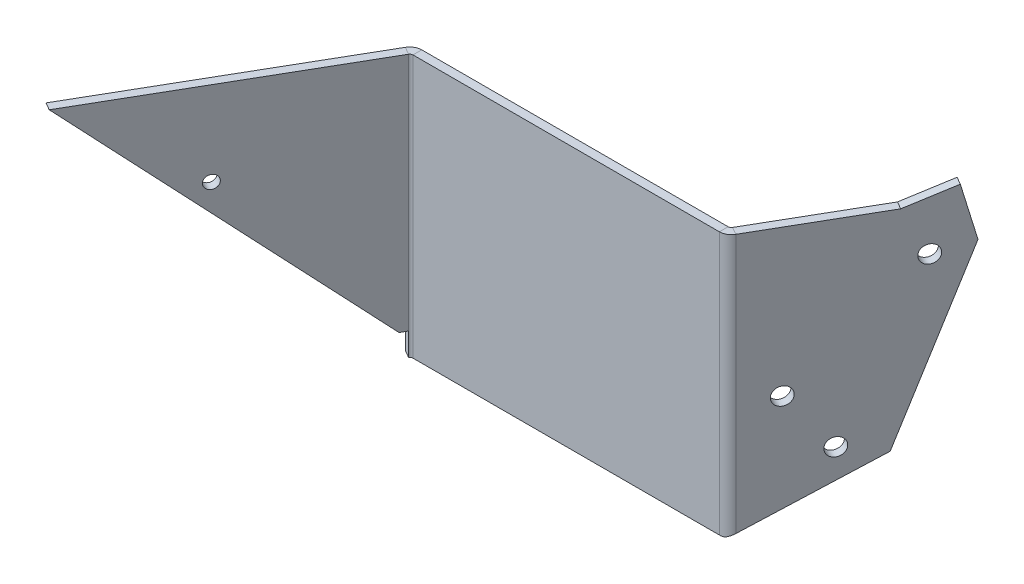
ISO-10303-21;
HEADER;
FILE_DESCRIPTION(('STEP AP214'),'2;1');
FILE_NAME('part.step','',(''),(''),'','','');
FILE_SCHEMA(('AUTOMOTIVE_DESIGN { 1 0 10303 214 1 1 1 1 }'));
ENDSEC;
DATA;
#1=APPLICATION_CONTEXT('core data for automotive mechanical design processes');
#2=APPLICATION_PROTOCOL_DEFINITION('international standard','automotive_design',2000,#1);
#3=PRODUCT_CONTEXT('',#1,'mechanical');
#4=PRODUCT('Part','Part','',(#3));
#5=PRODUCT_RELATED_PRODUCT_CATEGORY('part','',(#4));
#6=PRODUCT_DEFINITION_FORMATION('','',#4);
#7=PRODUCT_DEFINITION_CONTEXT('part definition',#1,'design');
#8=PRODUCT_DEFINITION('design','',#6,#7);
#9=PRODUCT_DEFINITION_SHAPE('','',#8);
#10=(LENGTH_UNIT() NAMED_UNIT(*) SI_UNIT(.MILLI.,.METRE.));
#11=(NAMED_UNIT(*) PLANE_ANGLE_UNIT() SI_UNIT($,.RADIAN.));
#12=(NAMED_UNIT(*) SI_UNIT($,.STERADIAN.) SOLID_ANGLE_UNIT());
#13=UNCERTAINTY_MEASURE_WITH_UNIT(LENGTH_MEASURE(1.E-05),#10,'distance_accuracy_value','');
#14=(GEOMETRIC_REPRESENTATION_CONTEXT(3) GLOBAL_UNCERTAINTY_ASSIGNED_CONTEXT((#13)) GLOBAL_UNIT_ASSIGNED_CONTEXT((#10,
#11,#12)) REPRESENTATION_CONTEXT('',''));
#15=CARTESIAN_POINT('',(0.,0.,0.));
#16=DIRECTION('',(0.,0.,1.));
#17=DIRECTION('',(1.,0.,0.));
#18=AXIS2_PLACEMENT_3D('',#15,#16,#17);
#19=CARTESIAN_POINT('',(-52.3949709333305,-24.77,26.392373452712));
#20=DIRECTION('',(0.,-1.,0.));
#21=DIRECTION('',(0.500000000000004,0.,-0.866025403784436));
#22=AXIS2_PLACEMENT_3D('',#19,#20,#21);
#23=PLANE('',#22);
#24=DIRECTION('',(-0.866025403784436,0.,-0.500000000000004));
#25=VECTOR('',#24,1.);
#26=CARTESIAN_POINT('',(-37.3699651199965,-24.77,0.368299999999989));
#27=LINE('',#26,#25);
#28=CARTESIAN_POINT('',(-35.6379143124276,-24.77,1.3683));
#29=VERTEX_POINT('',#28);
#30=CARTESIAN_POINT('',(-37.3699651199965,-24.77,0.368299999999989));
#31=VERTEX_POINT('',#30);
#32=EDGE_CURVE('E11',#29,#31,#27,.T.);
#33=ORIENTED_EDGE('',*,*,#32,.F.);
#34=DIRECTION('',(-0.500000000000004,0.,0.866025403784436));
#35=VECTOR('',#34,1.);
#36=CARTESIAN_POINT('',(-26.2422635063927,-24.77,-14.9054445662278));
#37=LINE('',#36,#35);
#38=CARTESIAN_POINT('',(-36.4373869925521,-24.77,2.75302730123892));
#39=VERTEX_POINT('',#38);
#40=EDGE_CURVE('E290',#29,#39,#37,.T.);
#41=ORIENTED_EDGE('',*,*,#40,.T.);
#42=DIRECTION('',(-0.866025403784436,0.,-0.500000000000004));
#43=VECTOR('',#42,1.);
#44=CARTESIAN_POINT('',(-38.169437800121,-24.77,1.75302730123891));
#45=LINE('',#44,#43);
#46=CARTESIAN_POINT('',(-38.169437800121,-24.77,1.75302730123891));
#47=VERTEX_POINT('',#46);
#48=EDGE_CURVE('E58',#39,#47,#45,.T.);
#49=ORIENTED_EDGE('',*,*,#48,.T.);
#50=DIRECTION('',(0.500000000000004,0.,-0.866025403784436));
#51=VECTOR('',#50,1.);
#52=CARTESIAN_POINT('',(-52.3949709333305,-24.77,26.392373452712));
#53=LINE('',#52,#51);
#54=EDGE_CURVE('E341',#31,#47,#53,.F.);
#55=ORIENTED_EDGE('',*,*,#54,.F.);
#56=EDGE_LOOP('',(#33,#41,#49,#55));
#57=FACE_BOUND('',#56,.T.);
#58=ADVANCED_FACE('F47',(#57),#23,.T.);
#59=CARTESIAN_POINT('',(-67.4199767466646,30.,52.416446905424));
#60=DIRECTION('',(0.341722230403334,0.730002513004366,-0.591880265134327));
#61=DIRECTION('',(-0.365001256502186,0.683444460806663,0.63220072108826));
#62=AXIS2_PLACEMENT_3D('',#59,#60,#61);
#63=PLANE('',#62);
#64=ORIENTED_EDGE('',*,*,#48,.F.);
#65=DIRECTION('',(-0.365001256502186,0.683444460806663,0.63220072108826));
#66=VECTOR('',#65,1.);
#67=CARTESIAN_POINT('',(-65.6879259390957,30.,53.416446905424));
#68=LINE('',#67,#66);
#69=CARTESIAN_POINT('',(-65.6879259390957,30.,53.416446905424));
#70=VERTEX_POINT('',#69);
#71=EDGE_CURVE('E284',#39,#70,#68,.T.);
#72=ORIENTED_EDGE('',*,*,#71,.T.);
#73=DIRECTION('',(-0.866025403784436,0.,-0.500000000000004));
#74=VECTOR('',#73,1.);
#75=CARTESIAN_POINT('',(-67.4199767466646,30.,52.416446905424));
#76=LINE('',#75,#74);
#77=CARTESIAN_POINT('',(-67.4199767466646,30.,52.416446905424));
#78=VERTEX_POINT('',#77);
#79=EDGE_CURVE('E183',#70,#78,#76,.T.);
#80=ORIENTED_EDGE('',*,*,#79,.T.);
#81=DIRECTION('',(-0.365001256502186,0.683444460806663,0.63220072108826));
#82=VECTOR('',#81,1.);
#83=CARTESIAN_POINT('',(-67.4199767466646,30.,52.416446905424));
#84=LINE('',#83,#82);
#85=EDGE_CURVE('E191',#47,#78,#84,.T.);
#86=ORIENTED_EDGE('',*,*,#85,.F.);
#87=EDGE_LOOP('',(#64,#72,#80,#86));
#88=FACE_BOUND('',#87,.T.);
#89=ADVANCED_FACE('F348',(#88),#63,.F.);
#90=CARTESIAN_POINT('',(-27.9743143139616,30.,-15.9054445662278));
#91=DIRECTION('',(0.,1.,0.));
#92=DIRECTION('',(-0.500000000000004,0.,0.866025403784436));
#93=AXIS2_PLACEMENT_3D('',#90,#91,#92);
#94=PLANE('',#93);
#95=ORIENTED_EDGE('',*,*,#79,.F.);
#96=DIRECTION('',(-0.500000000000004,0.,0.866025403784436));
#97=VECTOR('',#96,1.);
#98=CARTESIAN_POINT('',(-26.2422635063927,30.,-14.9054445662278));
#99=LINE('',#98,#97);
#100=CARTESIAN_POINT('',(-35.6379143124276,30.,1.3683));
#101=VERTEX_POINT('',#100);
#102=EDGE_CURVE('E177',#101,#70,#99,.T.);
#103=ORIENTED_EDGE('',*,*,#102,.F.);
#104=DIRECTION('',(-0.866025403784436,0.,-0.500000000000004));
#105=VECTOR('',#104,1.);
#106=CARTESIAN_POINT('',(-37.3699651199965,30.,0.36829999999999));
#107=LINE('',#106,#105);
#108=CARTESIAN_POINT('',(-37.3699651199965,30.,0.36829999999999));
#109=VERTEX_POINT('',#108);
#110=EDGE_CURVE('E172',#101,#109,#107,.T.);
#111=ORIENTED_EDGE('',*,*,#110,.T.);
#112=DIRECTION('',(-0.500000000000004,0.,0.866025403784436));
#113=VECTOR('',#112,1.);
#114=CARTESIAN_POINT('',(-27.9743143139616,30.,-15.9054445662278));
#115=LINE('',#114,#113);
#116=EDGE_CURVE('E175',#109,#78,#115,.T.);
#117=ORIENTED_EDGE('',*,*,#116,.T.);
#118=EDGE_LOOP('',(#95,#103,#111,#117));
#119=FACE_BOUND('',#118,.T.);
#120=ADVANCED_FACE('F173',(#119),#94,.T.);
#121=CARTESIAN_POINT('',(-35.,30.,1.7366));
#122=DIRECTION('',(0.,1.,0.));
#123=DIRECTION('',(0.,0.,1.));
#124=AXIS2_PLACEMENT_3D('',#121,#122,#123);
#125=PLANE('',#124);
#126=ORIENTED_EDGE('',*,*,#110,.F.);
#127=CARTESIAN_POINT('',(-35.,30.,1.7366));
#128=DIRECTION('',(0.,1.,0.));
#129=DIRECTION('',(0.,0.,1.));
#130=AXIS2_PLACEMENT_3D('',#127,#128,#129);
#131=CIRCLE('',#130,0.736599999999998);
#132=CARTESIAN_POINT('',(-35.,30.,1.));
#133=VERTEX_POINT('',#132);
#134=EDGE_CURVE('E280',#101,#133,#131,.F.);
#135=ORIENTED_EDGE('',*,*,#134,.T.);
#136=DIRECTION('',(0.,0.,-1.));
#137=VECTOR('',#136,1.);
#138=CARTESIAN_POINT('',(-35.,30.,-0.999999999999999));
#139=LINE('',#138,#137);
#140=CARTESIAN_POINT('',(-35.,30.,-0.999999999999999));
#141=VERTEX_POINT('',#140);
#142=EDGE_CURVE('E132',#133,#141,#139,.T.);
#143=ORIENTED_EDGE('',*,*,#142,.T.);
#144=CARTESIAN_POINT('',(-35.,30.,1.7366));
#145=DIRECTION('',(0.,-1.,0.));
#146=DIRECTION('',(0.,0.,1.));
#147=AXIS2_PLACEMENT_3D('',#144,#145,#146);
#148=CIRCLE('',#147,2.7366);
#149=EDGE_CURVE('E194',#109,#141,#148,.T.);
#150=ORIENTED_EDGE('',*,*,#149,.F.);
#151=EDGE_LOOP('',(#126,#135,#143,#150));
#152=FACE_BOUND('',#151,.T.);
#153=ADVANCED_FACE('F196',(#152),#125,.T.);
#154=CARTESIAN_POINT('',(35.,30.,-1.));
#155=DIRECTION('',(0.,1.,0.));
#156=DIRECTION('',(1.,0.,0.));
#157=AXIS2_PLACEMENT_3D('',#154,#155,#156);
#158=PLANE('',#157);
#159=ORIENTED_EDGE('',*,*,#142,.F.);
#160=DIRECTION('',(1.,0.,0.));
#161=VECTOR('',#160,1.);
#162=CARTESIAN_POINT('',(0.,30.,1.));
#163=LINE('',#162,#161);
#164=CARTESIAN_POINT('',(35.,30.,1.));
#165=VERTEX_POINT('',#164);
#166=EDGE_CURVE('E220',#133,#165,#163,.T.);
#167=ORIENTED_EDGE('',*,*,#166,.T.);
#168=DIRECTION('',(0.,0.,-1.));
#169=VECTOR('',#168,1.);
#170=CARTESIAN_POINT('',(35.,30.,-0.999999999999987));
#171=LINE('',#170,#169);
#172=CARTESIAN_POINT('',(35.,30.,-0.999999999999987));
#173=VERTEX_POINT('',#172);
#174=EDGE_CURVE('E332',#165,#173,#171,.T.);
#175=ORIENTED_EDGE('',*,*,#174,.T.);
#176=DIRECTION('',(1.,0.,0.));
#177=VECTOR('',#176,1.);
#178=CARTESIAN_POINT('',(35.,30.,-1.));
#179=LINE('',#178,#177);
#180=EDGE_CURVE('E413',#141,#173,#179,.T.);
#181=ORIENTED_EDGE('',*,*,#180,.F.);
#182=EDGE_LOOP('',(#159,#167,#175,#181));
#183=FACE_BOUND('',#182,.T.);
#184=ADVANCED_FACE('F431',(#183),#158,.T.);
#185=CARTESIAN_POINT('',(35.,30.,-1.7366));
#186=DIRECTION('',(0.,1.,0.));
#187=DIRECTION('',(0.,0.,1.));
#188=AXIS2_PLACEMENT_3D('',#185,#186,#187);
#189=PLANE('',#188);
#190=ORIENTED_EDGE('',*,*,#174,.F.);
#191=CARTESIAN_POINT('',(35.,30.,-1.7366));
#192=DIRECTION('',(0.,1.,0.));
#193=DIRECTION('',(0.,0.,1.));
#194=AXIS2_PLACEMENT_3D('',#191,#192,#193);
#195=CIRCLE('',#194,2.73660000000001);
#196=CARTESIAN_POINT('',(37.3699651199965,30.,-0.368299999999981));
#197=VERTEX_POINT('',#196);
#198=EDGE_CURVE('E246',#197,#165,#195,.F.);
#199=ORIENTED_EDGE('',*,*,#198,.F.);
#200=DIRECTION('',(-0.866025403784436,0.,-0.500000000000004));
#201=VECTOR('',#200,1.);
#202=CARTESIAN_POINT('',(35.6379143124276,30.,-1.36829999999999));
#203=LINE('',#202,#201);
#204=CARTESIAN_POINT('',(35.6379143124276,30.,-1.36829999999999));
#205=VERTEX_POINT('',#204);
#206=EDGE_CURVE('E328',#197,#205,#203,.T.);
#207=ORIENTED_EDGE('',*,*,#206,.T.);
#208=CARTESIAN_POINT('',(35.,30.,-1.7366));
#209=DIRECTION('',(0.,-1.,0.));
#210=DIRECTION('',(0.,0.,1.));
#211=AXIS2_PLACEMENT_3D('',#208,#209,#210);
#212=CIRCLE('',#211,0.736600000000014);
#213=EDGE_CURVE('E354',#205,#173,#212,.T.);
#214=ORIENTED_EDGE('',*,*,#213,.T.);
#215=EDGE_LOOP('',(#190,#199,#207,#214));
#216=FACE_BOUND('',#215,.T.);
#217=ADVANCED_FACE('F440',(#216),#189,.T.);
#218=CARTESIAN_POINT('',(69.8479259390957,30.,-60.6217782649106));
#219=DIRECTION('',(0.,-1.,0.));
#220=DIRECTION('',(-0.500000000000004,0.,0.866025403784436));
#221=AXIS2_PLACEMENT_3D('',#218,#219,#220);
#222=PLANE('',#221);
#223=ORIENTED_EDGE('',*,*,#206,.F.);
#224=DIRECTION('',(0.500000000000004,0.,-0.866025403784436));
#225=VECTOR('',#224,1.);
#226=CARTESIAN_POINT('',(27.9743143139616,30.,15.9054445662278));
#227=LINE('',#226,#225);
#228=CARTESIAN_POINT('',(51.1599651199966,30.,-24.2532806363747));
#229=VERTEX_POINT('',#228);
#230=EDGE_CURVE('E231',#197,#229,#227,.T.);
#231=ORIENTED_EDGE('',*,*,#230,.T.);
#232=DIRECTION('',(-0.866025403784436,0.,-0.500000000000004));
#233=VECTOR('',#232,1.);
#234=CARTESIAN_POINT('',(49.4279143124277,30.,-25.2532806363747));
#235=LINE('',#234,#233);
#236=CARTESIAN_POINT('',(49.4279143124277,30.,-25.2532806363747));
#237=VERTEX_POINT('',#236);
#238=EDGE_CURVE('E326',#229,#237,#235,.T.);
#239=ORIENTED_EDGE('',*,*,#238,.T.);
#240=DIRECTION('',(-0.500000000000004,0.,0.866025403784436));
#241=VECTOR('',#240,1.);
#242=CARTESIAN_POINT('',(69.8479259390957,30.,-60.6217782649106));
#243=LINE('',#242,#241);
#244=EDGE_CURVE('E381',#205,#237,#243,.F.);
#245=ORIENTED_EDGE('',*,*,#244,.F.);
#246=EDGE_LOOP('',(#223,#231,#239,#245));
#247=FACE_BOUND('',#246,.T.);
#248=ADVANCED_FACE('F456',(#247),#222,.F.);
#249=CARTESIAN_POINT('',(59.4979143124278,36.1629106235044,-42.6950322685933));
#250=DIRECTION('',(-0.146305139516736,0.95623178393314,0.253407935051437));
#251=DIRECTION('',(0.478115891966574,0.29261027903347,-0.828121016792209));
#252=AXIS2_PLACEMENT_3D('',#249,#250,#251);
#253=PLANE('',#252);
#254=ORIENTED_EDGE('',*,*,#238,.F.);
#255=DIRECTION('',(0.478115891966574,0.29261027903347,-0.828121016792209));
#256=VECTOR('',#255,1.);
#257=CARTESIAN_POINT('',(61.2299651199967,36.1629106235044,-41.6950322685933));
#258=LINE('',#257,#256);
#259=CARTESIAN_POINT('',(56.1468502366864,33.0520086657243,-32.8908190299904));
#260=VERTEX_POINT('',#259);
#261=EDGE_CURVE('E261',#229,#260,#258,.T.);
#262=ORIENTED_EDGE('',*,*,#261,.T.);
#263=DIRECTION('',(-0.866025403784436,0.,-0.500000000000004));
#264=VECTOR('',#263,1.);
#265=CARTESIAN_POINT('',(54.4147994291175,33.0520086657242,-33.8908190299904));
#266=LINE('',#265,#264);
#267=CARTESIAN_POINT('',(54.4147994291175,33.0520086657242,-33.8908190299904));
#268=VERTEX_POINT('',#267);
#269=EDGE_CURVE('E324',#260,#268,#266,.T.);
#270=ORIENTED_EDGE('',*,*,#269,.T.);
#271=DIRECTION('',(0.478115891966574,0.29261027903347,-0.828121016792209));
#272=VECTOR('',#271,1.);
#273=CARTESIAN_POINT('',(59.4979143124278,36.1629106235044,-42.6950322685933));
#274=LINE('',#273,#272);
#275=EDGE_CURVE('E380',#237,#268,#274,.T.);
#276=ORIENTED_EDGE('',*,*,#275,.F.);
#277=EDGE_LOOP('',(#254,#262,#270,#276));
#278=FACE_BOUND('',#277,.T.);
#279=ADVANCED_FACE('F683',(#278),#253,.T.);
#280=CARTESIAN_POINT('',(54.4147994291175,33.0520086657242,-33.8908190299904));
#281=DIRECTION('',(-0.48415937874254,-0.249717408088754,0.838588642943053));
#282=DIRECTION('',(-0.124858704044378,0.968318757485072,0.216261619172066));
#283=AXIS2_PLACEMENT_3D('',#280,#281,#282);
#284=PLANE('',#283);
#285=ORIENTED_EDGE('',*,*,#269,.F.);
#286=DIRECTION('',(-0.124858704044378,0.968318757485072,0.216261619172066));
#287=VECTOR('',#286,1.);
#288=CARTESIAN_POINT('',(56.1468502366864,33.0520086657242,-32.8908190299904));
#289=LINE('',#288,#287);
#290=CARTESIAN_POINT('',(57.6256988388714,21.5830698205205,-35.4522599456771));
#291=VERTEX_POINT('',#290);
#292=EDGE_CURVE('E260',#291,#260,#289,.T.);
#293=ORIENTED_EDGE('',*,*,#292,.F.);
#294=DIRECTION('',(-0.866025403784436,0.,-0.500000000000004));
#295=VECTOR('',#294,1.);
#296=CARTESIAN_POINT('',(55.8936480313026,21.5830698205205,-36.4522599456771));
#297=LINE('',#296,#295);
#298=CARTESIAN_POINT('',(55.8936480313026,21.5830698205205,-36.4522599456771));
#299=VERTEX_POINT('',#298);
#300=EDGE_CURVE('E316',#291,#299,#297,.T.);
#301=ORIENTED_EDGE('',*,*,#300,.T.);
#302=DIRECTION('',(-0.124858704044378,0.968318757485072,0.216261619172066));
#303=VECTOR('',#302,1.);
#304=CARTESIAN_POINT('',(54.4147994291175,33.0520086657242,-33.8908190299904));
#305=LINE('',#304,#303);
#306=EDGE_CURVE('E373',#299,#268,#305,.T.);
#307=ORIENTED_EDGE('',*,*,#306,.T.);
#308=EDGE_LOOP('',(#285,#293,#301,#307));
#309=FACE_BOUND('',#308,.T.);
#310=ADVANCED_FACE('F678',(#309),#284,.F.);
#311=CARTESIAN_POINT('',(48.5513043562291,-17.64,-23.7349476538179));
#312=DIRECTION('',(-0.468258578098388,0.350621756525628,0.811047648346359));
#313=DIRECTION('',(0.175310878262815,0.936517156196769,-0.303647348270715));
#314=AXIS2_PLACEMENT_3D('',#311,#312,#313);
#315=PLANE('',#314);
#316=ORIENTED_EDGE('',*,*,#300,.F.);
#317=DIRECTION('',(0.175310878262815,0.936517156196769,-0.303647348270715));
#318=VECTOR('',#317,1.);
#319=CARTESIAN_POINT('',(50.2833551637979,-17.64,-22.7349476538179));
#320=LINE('',#319,#318);
#321=CARTESIAN_POINT('',(50.2833551637979,-17.64,-22.7349476538179));
#322=VERTEX_POINT('',#321);
#323=EDGE_CURVE('E255',#322,#291,#320,.T.);
#324=ORIENTED_EDGE('',*,*,#323,.F.);
#325=DIRECTION('',(-0.866025403784436,0.,-0.500000000000004));
#326=VECTOR('',#325,1.);
#327=CARTESIAN_POINT('',(48.5513043562291,-17.64,-23.7349476538179));
#328=LINE('',#327,#326);
#329=CARTESIAN_POINT('',(48.5513043562291,-17.64,-23.7349476538179));
#330=VERTEX_POINT('',#329);
#331=EDGE_CURVE('E319',#322,#330,#328,.T.);
#332=ORIENTED_EDGE('',*,*,#331,.T.);
#333=DIRECTION('',(0.175310878262815,0.936517156196769,-0.303647348270715));
#334=VECTOR('',#333,1.);
#335=CARTESIAN_POINT('',(48.5513043562291,-17.64,-23.7349476538179));
#336=LINE('',#335,#334);
#337=EDGE_CURVE('E372',#330,#299,#336,.T.);
#338=ORIENTED_EDGE('',*,*,#337,.T.);
#339=EDGE_LOOP('',(#316,#324,#332,#338));
#340=FACE_BOUND('',#339,.T.);
#341=ADVANCED_FACE('F667',(#340),#315,.F.);
#342=CARTESIAN_POINT('',(34.7629143124276,-30.,0.147244456622799));
#343=DIRECTION('',(-0.204500330906686,0.912534086287316,0.354204963295023));
#344=DIRECTION('',(0.456267043143662,0.409000661813368,-0.790277700544035));
#345=AXIS2_PLACEMENT_3D('',#342,#343,#344);
#346=PLANE('',#345);
#347=ORIENTED_EDGE('',*,*,#331,.F.);
#348=DIRECTION('',(0.456267043143662,0.409000661813368,-0.790277700544035));
#349=VECTOR('',#348,1.);
#350=CARTESIAN_POINT('',(36.4949651199965,-30.,1.14724445662281));
#351=LINE('',#350,#349);
#352=CARTESIAN_POINT('',(37.3699651199965,-29.2156444685968,-0.368299999999984));
#353=VERTEX_POINT('',#352);
#354=EDGE_CURVE('E251',#353,#322,#351,.T.);
#355=ORIENTED_EDGE('',*,*,#354,.F.);
#356=DIRECTION('',(-0.866025403784436,0.,-0.500000000000004));
#357=VECTOR('',#356,1.);
#358=CARTESIAN_POINT('',(35.6379143124276,-29.2156444685968,-1.36829999999999));
#359=LINE('',#358,#357);
#360=CARTESIAN_POINT('',(35.6379143124276,-29.2156444685968,-1.36829999999999));
#361=VERTEX_POINT('',#360);
#362=EDGE_CURVE('E311',#353,#361,#359,.T.);
#363=ORIENTED_EDGE('',*,*,#362,.T.);
#364=DIRECTION('',(0.456267043143662,0.409000661813368,-0.790277700544035));
#365=VECTOR('',#364,1.);
#366=CARTESIAN_POINT('',(34.7629143124276,-30.,0.147244456622799));
#367=LINE('',#366,#365);
#368=EDGE_CURVE('E369',#361,#330,#367,.T.);
#369=ORIENTED_EDGE('',*,*,#368,.T.);
#370=EDGE_LOOP('',(#347,#355,#363,#369));
#371=FACE_BOUND('',#370,.T.);
#372=ADVANCED_FACE('F476',(#371),#346,.F.);
#373=CARTESIAN_POINT('',(36.3683,-27.9890916987466,-4.1065651199965));
#374=CARTESIAN_POINT('',(36.0349666666667,-27.9890916987466,-3.52921485080688));
#375=CARTESIAN_POINT('',(35.7016333333333,-27.9890916987466,-2.95186458161725));
#376=CARTESIAN_POINT('',(35.3683,-27.9890916987466,-2.37451431242763));
#377=CARTESIAN_POINT('',(31.628369760007,-27.9890916987466,-6.84316511999654));
#378=CARTESIAN_POINT('',(32.4497369650529,-27.9890916987466,-5.59914818414024));
#379=CARTESIAN_POINT('',(33.2711041700988,-27.9890916987466,-4.35513124828395));
#380=CARTESIAN_POINT('',(34.0924713751447,-27.9890916987466,-3.11111431242765));
#381=CARTESIAN_POINT('',(28.891769760007,-30.442197238447,-2.10323488000353));
#382=CARTESIAN_POINT('',(30.3798036317196,-30.4421972384471,-2.01391848252649));
#383=CARTESIAN_POINT('',(31.8678375034321,-30.442197238447,-1.92460208504944));
#384=CARTESIAN_POINT('',(33.3558713751447,-30.442197238447,-1.83528568757239));
#385=CARTESIAN_POINT('',(33.6317,-30.442197238447,0.633365119996502));
#386=CARTESIAN_POINT('',(33.9650333333333,-30.442197238447,0.0560148508068768));
#387=CARTESIAN_POINT('',(34.2983666666666,-30.442197238447,-0.521335418382748));
#388=CARTESIAN_POINT('',(34.6317,-30.442197238447,-1.09868568757237));
#389=CARTESIAN_POINT('',(38.371630239993,-30.442197238447,3.36996511999653));
#390=CARTESIAN_POINT('',(37.5502630349471,-30.442197238447,2.12594818414024));
#391=CARTESIAN_POINT('',(36.7288958299012,-30.442197238447,0.881931248283943));
#392=CARTESIAN_POINT('',(35.9075286248552,-30.442197238447,-0.362085687572353));
#393=CARTESIAN_POINT('',(41.108230239993,-27.9890916987465,-1.36996511999647));
#394=CARTESIAN_POINT('',(39.6201963682804,-27.9890916987466,-1.45928151747352));
#395=CARTESIAN_POINT('',(38.1321624965679,-27.9890916987466,-1.54859791495056));
#396=CARTESIAN_POINT('',(36.6441286248553,-27.9890916987466,-1.63791431242761));
#397=CARTESIAN_POINT('',(36.3683,-27.9890916987466,-4.1065651199965));
#398=CARTESIAN_POINT('',(36.0349666666667,-27.9890916987466,-3.52921485080688));
#399=CARTESIAN_POINT('',(35.7016333333333,-27.9890916987466,-2.95186458161725));
#400=CARTESIAN_POINT('',(35.3683,-27.9890916987466,-2.37451431242763));
#401=(BOUNDED_SURFACE() B_SPLINE_SURFACE(3,3,((#373,#374,#375,#376),(#377,#378,#379,#380),(#381,
#382,#383,#384),(#385,#386,#387,#388),(#389,#390,#391,#392),(#393,#394,#395,#396),(#397,#398,
#399,#400)),.UNSPECIFIED.,.T.,.F.,.F.) B_SPLINE_SURFACE_WITH_KNOTS((4,3,4),(4,4),(0.,0.5,1.),
(0.,1.),.UNSPECIFIED.) GEOMETRIC_REPRESENTATION_ITEM() RATIONAL_B_SPLINE_SURFACE(((1.,1.,1.,1.),
(0.333333333333333,0.333333333333333,0.333333333333333,0.333333333333333),(0.333333333333333,
0.333333333333333,0.333333333333333,0.333333333333333),(1.,1.,1.,1.),(0.333333333333333,
0.333333333333333,0.333333333333333,0.333333333333333),(0.333333333333333,0.333333333333333,
0.333333333333333,0.333333333333333),(1.,1.,1.,1.))) REPRESENTATION_ITEM('') SURFACE());
#402=CARTESIAN_POINT('',(35.,-29.2156444685968,-1.7366));
#403=DIRECTION('',(0.204500330906686,-0.912534086287316,-0.354204963295024));
#404=DIRECTION('',(0.456267043143661,0.409000661813368,-0.790277700544035));
#405=AXIS2_PLACEMENT_3D('',#402,#403,#404);
#406=ELLIPSE('',#405,2.99890167515165,2.73660000000001);
#407=CARTESIAN_POINT('',(35.9470482073754,-30.,0.830904479627469));
#408=VERTEX_POINT('',#407);
#409=EDGE_CURVE('E247',#408,#353,#406,.F.);
#410=DIRECTION('',(-0.346067458662353,0.,-0.938209632254424));
#411=VECTOR('',#410,1.);
#412=CARTESIAN_POINT('',(35.2549132900507,-30.,-1.04551478488138));
#413=LINE('',#412,#411);
#414=CARTESIAN_POINT('',(35.2549132900507,-30.,-1.04551478488138));
#415=VERTEX_POINT('',#414);
#416=EDGE_CURVE('E312',#408,#415,#413,.T.);
#417=CARTESIAN_POINT('',(35.,-29.2156444685968,-1.7366));
#418=DIRECTION('',(0.428643385472539,-0.514839190779579,-0.742432121966761));
#419=DIRECTION('',(0.257419595389791,0.857286770945072,-0.445863818078938));
#420=AXIS2_PLACEMENT_3D('',#417,#418,#419);
#421=ELLIPSE('',#420,1.4307380113869,0.736600000000014);
#422=EDGE_CURVE('E364',#415,#361,#421,.F.);
#423=ORIENTED_EDGE('',*,*,#362,.F.);
#424=ORIENTED_EDGE('',*,*,#409,.F.);
#425=ORIENTED_EDGE('',*,*,#416,.T.);
#426=ORIENTED_EDGE('',*,*,#422,.T.);
#427=EDGE_LOOP('',(#423,#424,#425,#426));
#428=FACE_BOUND('',#427,.T.);
#429=ADVANCED_FACE('F469',(#428),#401,.F.);
#430=CARTESIAN_POINT('',(35.,-30.,-1.7366));
#431=DIRECTION('',(0.,1.,0.));
#432=DIRECTION('',(0.,0.,1.));
#433=AXIS2_PLACEMENT_3D('',#430,#431,#432);
#434=PLANE('',#433);
#435=ORIENTED_EDGE('',*,*,#416,.F.);
#436=CARTESIAN_POINT('',(35.,-30.,-1.7366));
#437=DIRECTION('',(0.,1.,0.));
#438=DIRECTION('',(0.,0.,1.));
#439=AXIS2_PLACEMENT_3D('',#436,#437,#438);
#440=CIRCLE('',#439,2.73660000000001);
#441=CARTESIAN_POINT('',(35.,-30.,1.));
#442=VERTEX_POINT('',#441);
#443=EDGE_CURVE('E244',#442,#408,#440,.T.);
#444=ORIENTED_EDGE('',*,*,#443,.F.);
#445=DIRECTION('',(0.,0.,-1.));
#446=VECTOR('',#445,1.);
#447=CARTESIAN_POINT('',(35.,-30.,-0.999999999999987));
#448=LINE('',#447,#446);
#449=CARTESIAN_POINT('',(35.,-30.,-0.999999999999987));
#450=VERTEX_POINT('',#449);
#451=EDGE_CURVE('E306',#442,#450,#448,.T.);
#452=ORIENTED_EDGE('',*,*,#451,.T.);
#453=CARTESIAN_POINT('',(35.,-30.,-1.7366));
#454=DIRECTION('',(0.,-1.,0.));
#455=DIRECTION('',(0.,0.,1.));
#456=AXIS2_PLACEMENT_3D('',#453,#454,#455);
#457=CIRCLE('',#456,0.736600000000014);
#458=EDGE_CURVE('E356',#450,#415,#457,.F.);
#459=ORIENTED_EDGE('',*,*,#458,.T.);
#460=EDGE_LOOP('',(#435,#444,#452,#459));
#461=FACE_BOUND('',#460,.T.);
#462=ADVANCED_FACE('F467',(#461),#434,.F.);
#463=CARTESIAN_POINT('',(35.,-30.,-1.));
#464=DIRECTION('',(0.,-1.,0.));
#465=DIRECTION('',(-1.,0.,0.));
#466=AXIS2_PLACEMENT_3D('',#463,#464,#465);
#467=PLANE('',#466);
#468=ORIENTED_EDGE('',*,*,#451,.F.);
#469=DIRECTION('',(1.,0.,0.));
#470=VECTOR('',#469,1.);
#471=CARTESIAN_POINT('',(0.,-30.,1.));
#472=LINE('',#471,#470);
#473=CARTESIAN_POINT('',(-35.,-30.,1.));
#474=VERTEX_POINT('',#473);
#475=EDGE_CURVE('E227',#442,#474,#472,.F.);
#476=ORIENTED_EDGE('',*,*,#475,.T.);
#477=DIRECTION('',(0.,0.,-1.));
#478=VECTOR('',#477,1.);
#479=CARTESIAN_POINT('',(-35.,-30.,-1.));
#480=LINE('',#479,#478);
#481=CARTESIAN_POINT('',(-35.,-30.,-1.));
#482=VERTEX_POINT('',#481);
#483=EDGE_CURVE('E301',#474,#482,#480,.T.);
#484=ORIENTED_EDGE('',*,*,#483,.T.);
#485=DIRECTION('',(-1.,0.,0.));
#486=VECTOR('',#485,1.);
#487=CARTESIAN_POINT('',(35.,-30.,-1.));
#488=LINE('',#487,#486);
#489=EDGE_CURVE('E404',#450,#482,#488,.T.);
#490=ORIENTED_EDGE('',*,*,#489,.F.);
#491=EDGE_LOOP('',(#468,#476,#484,#490));
#492=FACE_BOUND('',#491,.T.);
#493=ADVANCED_FACE('F449',(#492),#467,.T.);
#494=CARTESIAN_POINT('',(-35.,-30.,1.7366));
#495=DIRECTION('',(0.,1.,0.));
#496=DIRECTION('',(0.,0.,1.));
#497=AXIS2_PLACEMENT_3D('',#494,#495,#496);
#498=PLANE('',#497);
#499=ORIENTED_EDGE('',*,*,#483,.F.);
#500=CARTESIAN_POINT('',(-35.,-30.,1.7366));
#501=DIRECTION('',(0.,1.,0.));
#502=DIRECTION('',(0.,0.,1.));
#503=AXIS2_PLACEMENT_3D('',#500,#501,#502);
#504=CIRCLE('',#503,0.736599999999998);
#505=CARTESIAN_POINT('',(-35.6379143124276,-30.,1.3683));
#506=VERTEX_POINT('',#505);
#507=EDGE_CURVE('E225',#474,#506,#504,.T.);
#508=ORIENTED_EDGE('',*,*,#507,.T.);
#509=DIRECTION('',(-0.866025403784436,0.,-0.500000000000004));
#510=VECTOR('',#509,1.);
#511=CARTESIAN_POINT('',(-37.3699651199965,-30.,0.368299999999989));
#512=LINE('',#511,#510);
#513=CARTESIAN_POINT('',(-37.3699651199965,-30.,0.368299999999989));
#514=VERTEX_POINT('',#513);
#515=EDGE_CURVE('E52',#506,#514,#512,.T.);
#516=ORIENTED_EDGE('',*,*,#515,.T.);
#517=CARTESIAN_POINT('',(-35.,-30.,1.7366));
#518=DIRECTION('',(0.,-1.,0.));
#519=DIRECTION('',(0.,0.,1.));
#520=AXIS2_PLACEMENT_3D('',#517,#518,#519);
#521=CIRCLE('',#520,2.7366);
#522=EDGE_CURVE('E207',#482,#514,#521,.F.);
#523=ORIENTED_EDGE('',*,*,#522,.F.);
#524=EDGE_LOOP('',(#499,#508,#516,#523));
#525=FACE_BOUND('',#524,.T.);
#526=ADVANCED_FACE('F422',(#525),#498,.F.);
#527=CARTESIAN_POINT('',(51.8547994291175,20.1820086657242,-29.4567689626141));
#528=DIRECTION('',(-0.866025403784436,0.,-0.500000000000004));
#529=DIRECTION('',(-0.500000000000004,0.,0.866025403784436));
#530=AXIS2_PLACEMENT_3D('',#527,#528,#529);
#531=CYLINDRICAL_SURFACE('',#530,2.);
#532=CARTESIAN_POINT('',(51.8547994291175,20.1820086657242,-29.4567689626141));
#533=DIRECTION('',(0.866025403784436,0.,0.500000000000004));
#534=DIRECTION('',(0.500000000000004,0.,-0.866025403784436));
#535=AXIS2_PLACEMENT_3D('',#532,#533,#534);
#536=CIRCLE('',#535,2.);
#537=CARTESIAN_POINT('',(52.8547994291175,20.1820086657242,-31.188819770183));
#538=VERTEX_POINT('',#537);
#539=EDGE_CURVE('E398',#538,#538,#536,.T.);
#540=ORIENTED_EDGE('',*,*,#539,.F.);
#541=EDGE_LOOP('',(#540));
#542=FACE_BOUND('',#541,.T.);
#543=CARTESIAN_POINT('',(53.5868502366864,20.1820086657242,-28.4567689626141));
#544=DIRECTION('',(0.866025403784436,0.,0.500000000000004));
#545=DIRECTION('',(0.500000000000004,0.,-0.866025403784436));
#546=AXIS2_PLACEMENT_3D('',#543,#544,#545);
#547=CIRCLE('',#546,2.);
#548=CARTESIAN_POINT('',(54.5868502366864,20.1820086657242,-30.188819770183));
#549=VERTEX_POINT('',#548);
#550=EDGE_CURVE('E243',#549,#549,#547,.T.);
#551=ORIENTED_EDGE('',*,*,#550,.T.);
#552=EDGE_LOOP('',(#551));
#553=FACE_BOUND('',#552,.T.);
#554=ADVANCED_FACE('F493',(#542,#553),#531,.F.);
#555=CARTESIAN_POINT('',(44.001304356229,-15.1,-15.8541164793796));
#556=DIRECTION('',(-0.866025403784436,0.,-0.500000000000004));
#557=DIRECTION('',(-0.500000000000004,0.,0.866025403784436));
#558=AXIS2_PLACEMENT_3D('',#555,#556,#557);
#559=CYLINDRICAL_SURFACE('',#558,2.);
#560=CARTESIAN_POINT('',(44.001304356229,-15.1,-15.8541164793796));
#561=DIRECTION('',(0.866025403784436,0.,0.500000000000004));
#562=DIRECTION('',(0.500000000000004,0.,-0.866025403784436));
#563=AXIS2_PLACEMENT_3D('',#560,#561,#562);
#564=CIRCLE('',#563,2.);
#565=CARTESIAN_POINT('',(45.001304356229,-15.1,-17.5861672869484));
#566=VERTEX_POINT('',#565);
#567=EDGE_CURVE('E391',#566,#566,#564,.T.);
#568=ORIENTED_EDGE('',*,*,#567,.F.);
#569=EDGE_LOOP('',(#568));
#570=FACE_BOUND('',#569,.T.);
#571=CARTESIAN_POINT('',(45.7333551637979,-15.1,-14.8541164793796));
#572=DIRECTION('',(0.866025403784436,0.,0.500000000000004));
#573=DIRECTION('',(0.500000000000004,0.,-0.866025403784436));
#574=AXIS2_PLACEMENT_3D('',#571,#572,#573);
#575=CIRCLE('',#574,2.);
#576=CARTESIAN_POINT('',(46.7333551637979,-15.1,-16.5861672869484));
#577=VERTEX_POINT('',#576);
#578=EDGE_CURVE('E300',#577,#577,#575,.T.);
#579=ORIENTED_EDGE('',*,*,#578,.T.);
#580=EDGE_LOOP('',(#579));
#581=FACE_BOUND('',#580,.T.);
#582=ADVANCED_FACE('F494',(#570,#581),#559,.F.);
#583=CARTESIAN_POINT('',(39.526304356229,-3.42,-8.10318911550886));
#584=DIRECTION('',(-0.866025403784436,0.,-0.500000000000004));
#585=DIRECTION('',(-0.500000000000004,0.,0.866025403784436));
#586=AXIS2_PLACEMENT_3D('',#583,#584,#585);
#587=CYLINDRICAL_SURFACE('',#586,2.);
#588=CARTESIAN_POINT('',(39.526304356229,-3.42,-8.10318911550886));
#589=DIRECTION('',(0.866025403784436,0.,0.500000000000004));
#590=DIRECTION('',(0.500000000000004,0.,-0.866025403784436));
#591=AXIS2_PLACEMENT_3D('',#588,#589,#590);
#592=CIRCLE('',#591,2.);
#593=CARTESIAN_POINT('',(40.526304356229,-3.42,-9.83523992307773));
#594=VERTEX_POINT('',#593);
#595=EDGE_CURVE('E393',#594,#594,#592,.T.);
#596=ORIENTED_EDGE('',*,*,#595,.F.);
#597=EDGE_LOOP('',(#596));
#598=FACE_BOUND('',#597,.T.);
#599=CARTESIAN_POINT('',(41.2583551637979,-3.42,-7.10318911550885));
#600=DIRECTION('',(0.866025403784436,0.,0.500000000000004));
#601=DIRECTION('',(0.500000000000004,0.,-0.866025403784436));
#602=AXIS2_PLACEMENT_3D('',#599,#600,#601);
#603=CIRCLE('',#602,2.);
#604=CARTESIAN_POINT('',(42.2583551637979,-3.42,-8.83523992307772));
#605=VERTEX_POINT('',#604);
#606=EDGE_CURVE('E234',#605,#605,#603,.T.);
#607=ORIENTED_EDGE('',*,*,#606,.T.);
#608=EDGE_LOOP('',(#607));
#609=FACE_BOUND('',#608,.T.);
#610=ADVANCED_FACE('F51',(#598,#609),#587,.F.);
#611=CARTESIAN_POINT('',(-53.8623289158171,10.7605467589142,28.9339120312704));
#612=DIRECTION('',(0.866025403784436,0.,0.500000000000004));
#613=DIRECTION('',(0.500000000000004,0.,-0.866025403784436));
#614=AXIS2_PLACEMENT_3D('',#611,#612,#613);
#615=CYLINDRICAL_SURFACE('',#614,1.5);
#616=CARTESIAN_POINT('',(-53.8623289158171,10.7605467589142,28.9339120312704));
#617=DIRECTION('',(0.866025403784436,0.,0.500000000000004));
#618=DIRECTION('',(0.500000000000004,0.,-0.866025403784436));
#619=AXIS2_PLACEMENT_3D('',#616,#617,#618);
#620=CIRCLE('',#619,1.5);
#621=CARTESIAN_POINT('',(-53.1123289158171,10.7605467589142,27.6348739255938));
#622=VERTEX_POINT('',#621);
#623=EDGE_CURVE('E346',#622,#622,#620,.T.);
#624=ORIENTED_EDGE('',*,*,#623,.F.);
#625=EDGE_LOOP('',(#624));
#626=FACE_BOUND('',#625,.T.);
#627=CARTESIAN_POINT('',(-52.1302781082482,10.7605467589142,29.9339120312704));
#628=DIRECTION('',(0.866025403784436,0.,0.500000000000004));
#629=DIRECTION('',(0.500000000000004,0.,-0.866025403784436));
#630=AXIS2_PLACEMENT_3D('',#627,#628,#629);
#631=CIRCLE('',#630,1.5);
#632=CARTESIAN_POINT('',(-51.3802781082482,10.7605467589142,28.6348739255938));
#633=VERTEX_POINT('',#632);
#634=EDGE_CURVE('E273',#633,#633,#631,.T.);
#635=ORIENTED_EDGE('',*,*,#634,.T.);
#636=EDGE_LOOP('',(#635));
#637=FACE_BOUND('',#636,.T.);
#638=ADVANCED_FACE('F489',(#626,#637),#615,.F.);
#639=CARTESIAN_POINT('',(-37.3699651199965,-27.385,0.368299999999989));
#640=DIRECTION('',(-0.500000000000004,0.,0.866025403784436));
#641=DIRECTION('',(0.,1.,0.));
#642=AXIS2_PLACEMENT_3D('',#639,#640,#641);
#643=PLANE('',#642);
#644=DIRECTION('',(0.,1.,0.));
#645=VECTOR('',#644,1.);
#646=CARTESIAN_POINT('',(-35.6379143124276,30.,1.3683));
#647=LINE('',#646,#645);
#648=EDGE_CURVE('E240',#506,#29,#647,.T.);
#649=ORIENTED_EDGE('',*,*,#648,.T.);
#650=ORIENTED_EDGE('',*,*,#32,.T.);
#651=DIRECTION('',(0.,1.,0.));
#652=VECTOR('',#651,1.);
#653=CARTESIAN_POINT('',(-37.3699651199965,0.,0.368299999999988));
#654=LINE('',#653,#652);
#655=EDGE_CURVE('E201',#514,#31,#654,.T.);
#656=ORIENTED_EDGE('',*,*,#655,.F.);
#657=ORIENTED_EDGE('',*,*,#515,.F.);
#658=EDGE_LOOP('',(#649,#650,#656,#657));
#659=FACE_BOUND('',#658,.T.);
#660=ADVANCED_FACE('F419',(#659),#643,.T.);
#661=CARTESIAN_POINT('',(-35.,30.,1.7366));
#662=DIRECTION('',(0.,1.,0.));
#663=DIRECTION('',(-0.866025403784436,0.,-0.500000000000004));
#664=AXIS2_PLACEMENT_3D('',#661,#662,#663);
#665=CYLINDRICAL_SURFACE('',#664,2.7366);
#666=DIRECTION('',(0.,1.,0.));
#667=VECTOR('',#666,1.);
#668=CARTESIAN_POINT('',(-35.,-30.,-1.));
#669=LINE('',#668,#667);
#670=EDGE_CURVE('E279',#482,#141,#669,.T.);
#671=ORIENTED_EDGE('',*,*,#670,.F.);
#672=ORIENTED_EDGE('',*,*,#522,.T.);
#673=ORIENTED_EDGE('',*,*,#655,.T.);
#674=DIRECTION('',(0.,1.,0.));
#675=VECTOR('',#674,1.);
#676=CARTESIAN_POINT('',(-37.3699651199965,-30.,0.36829999999999));
#677=LINE('',#676,#675);
#678=EDGE_CURVE('E189',#109,#31,#677,.F.);
#679=ORIENTED_EDGE('',*,*,#678,.F.);
#680=ORIENTED_EDGE('',*,*,#149,.T.);
#681=EDGE_LOOP('',(#671,#672,#673,#679,#680));
#682=FACE_BOUND('',#681,.T.);
#683=ADVANCED_FACE('F203',(#682),#665,.T.);
#684=CARTESIAN_POINT('',(-27.9743143139616,0.,-15.9054445662278));
#685=DIRECTION('',(0.866025403784436,0.,0.500000000000004));
#686=DIRECTION('',(-0.500000000000004,0.,0.866025403784436));
#687=AXIS2_PLACEMENT_3D('',#684,#685,#686);
#688=PLANE('',#687);
#689=ORIENTED_EDGE('',*,*,#623,.T.);
#690=EDGE_LOOP('',(#689));
#691=FACE_BOUND('',#690,.T.);
#692=ORIENTED_EDGE('',*,*,#54,.T.);
#693=ORIENTED_EDGE('',*,*,#85,.T.);
#694=ORIENTED_EDGE('',*,*,#116,.F.);
#695=ORIENTED_EDGE('',*,*,#678,.T.);
#696=EDGE_LOOP('',(#692,#693,#694,#695));
#697=FACE_BOUND('',#696,.T.);
#698=ADVANCED_FACE('F190',(#691,#697),#688,.F.);
#699=CARTESIAN_POINT('',(35.,30.,-1.7366));
#700=DIRECTION('',(0.,1.,0.));
#701=DIRECTION('',(0.866025403784436,0.,0.500000000000004));
#702=AXIS2_PLACEMENT_3D('',#699,#700,#701);
#703=CYLINDRICAL_SURFACE('',#702,0.736600000000014);
#704=ORIENTED_EDGE('',*,*,#422,.F.);
#705=ORIENTED_EDGE('',*,*,#458,.F.);
#706=DIRECTION('',(0.,-1.,0.));
#707=VECTOR('',#706,1.);
#708=CARTESIAN_POINT('',(35.,-30.,-1.));
#709=LINE('',#708,#707);
#710=EDGE_CURVE('E407',#173,#450,#709,.T.);
#711=ORIENTED_EDGE('',*,*,#710,.F.);
#712=ORIENTED_EDGE('',*,*,#213,.F.);
#713=DIRECTION('',(0.,1.,0.));
#714=VECTOR('',#713,1.);
#715=CARTESIAN_POINT('',(35.6379143124276,-30.,-1.36829999999999));
#716=LINE('',#715,#714);
#717=EDGE_CURVE('E390',#361,#205,#716,.T.);
#718=ORIENTED_EDGE('',*,*,#717,.F.);
#719=EDGE_LOOP('',(#704,#705,#711,#712,#718));
#720=FACE_BOUND('',#719,.T.);
#721=ADVANCED_FACE('F441',(#720),#703,.F.);
#722=CARTESIAN_POINT('',(26.2422635063927,0.,14.9054445662278));
#723=DIRECTION('',(-0.866025403784436,0.,-0.500000000000004));
#724=DIRECTION('',(0.500000000000004,0.,-0.866025403784436));
#725=AXIS2_PLACEMENT_3D('',#722,#723,#724);
#726=PLANE('',#725);
#727=ORIENTED_EDGE('',*,*,#539,.T.);
#728=EDGE_LOOP('',(#727));
#729=FACE_BOUND('',#728,.T.);
#730=ORIENTED_EDGE('',*,*,#567,.T.);
#731=EDGE_LOOP('',(#730));
#732=FACE_BOUND('',#731,.T.);
#733=ORIENTED_EDGE('',*,*,#595,.T.);
#734=EDGE_LOOP('',(#733));
#735=FACE_BOUND('',#734,.T.);
#736=ORIENTED_EDGE('',*,*,#717,.T.);
#737=ORIENTED_EDGE('',*,*,#244,.T.);
#738=ORIENTED_EDGE('',*,*,#275,.T.);
#739=ORIENTED_EDGE('',*,*,#306,.F.);
#740=ORIENTED_EDGE('',*,*,#337,.F.);
#741=ORIENTED_EDGE('',*,*,#368,.F.);
#742=EDGE_LOOP('',(#736,#737,#738,#739,#740,#741));
#743=FACE_BOUND('',#742,.T.);
#744=ADVANCED_FACE('F465',(#729,#732,#735,#743),#726,.T.);
#745=CARTESIAN_POINT('',(0.,0.,-1.));
#746=DIRECTION('',(0.,0.,-1.));
#747=DIRECTION('',(1.,0.,0.));
#748=AXIS2_PLACEMENT_3D('',#745,#746,#747);
#749=PLANE('',#748);
#750=ORIENTED_EDGE('',*,*,#670,.T.);
#751=ORIENTED_EDGE('',*,*,#180,.T.);
#752=ORIENTED_EDGE('',*,*,#710,.T.);
#753=ORIENTED_EDGE('',*,*,#489,.T.);
#754=EDGE_LOOP('',(#750,#751,#752,#753));
#755=FACE_BOUND('',#754,.T.);
#756=ADVANCED_FACE('F418',(#755),#749,.T.);
#757=CARTESIAN_POINT('',(-35.,30.,1.7366));
#758=DIRECTION('',(0.,1.,0.));
#759=DIRECTION('',(-0.866025403784436,0.,-0.500000000000004));
#760=AXIS2_PLACEMENT_3D('',#757,#758,#759);
#761=CYLINDRICAL_SURFACE('',#760,0.736599999999998);
#762=DIRECTION('',(0.,-1.,0.));
#763=VECTOR('',#762,1.);
#764=CARTESIAN_POINT('',(-35.,0.,1.));
#765=LINE('',#764,#763);
#766=EDGE_CURVE('E213',#474,#133,#765,.F.);
#767=ORIENTED_EDGE('',*,*,#766,.T.);
#768=ORIENTED_EDGE('',*,*,#134,.F.);
#769=DIRECTION('',(0.,-1.,0.));
#770=VECTOR('',#769,1.);
#771=CARTESIAN_POINT('',(-35.6379143124276,0.,1.3683));
#772=LINE('',#771,#770);
#773=EDGE_CURVE('E216',#101,#29,#772,.T.);
#774=ORIENTED_EDGE('',*,*,#773,.T.);
#775=ORIENTED_EDGE('',*,*,#648,.F.);
#776=ORIENTED_EDGE('',*,*,#507,.F.);
#777=EDGE_LOOP('',(#767,#768,#774,#775,#776));
#778=FACE_BOUND('',#777,.T.);
#779=ADVANCED_FACE('F423',(#778),#761,.F.);
#780=CARTESIAN_POINT('',(-26.2422635063927,0.,-14.9054445662278));
#781=DIRECTION('',(0.866025403784436,0.,0.500000000000004));
#782=DIRECTION('',(-0.500000000000004,0.,0.866025403784436));
#783=AXIS2_PLACEMENT_3D('',#780,#781,#782);
#784=PLANE('',#783);
#785=ORIENTED_EDGE('',*,*,#634,.F.);
#786=EDGE_LOOP('',(#785));
#787=FACE_BOUND('',#786,.T.);
#788=ORIENTED_EDGE('',*,*,#40,.F.);
#789=ORIENTED_EDGE('',*,*,#773,.F.);
#790=ORIENTED_EDGE('',*,*,#102,.T.);
#791=ORIENTED_EDGE('',*,*,#71,.F.);
#792=EDGE_LOOP('',(#788,#789,#790,#791));
#793=FACE_BOUND('',#792,.T.);
#794=ADVANCED_FACE('F517',(#787,#793),#784,.T.);
#795=CARTESIAN_POINT('',(35.,30.,-1.7366));
#796=DIRECTION('',(0.,1.,0.));
#797=DIRECTION('',(0.866025403784436,0.,0.500000000000004));
#798=AXIS2_PLACEMENT_3D('',#795,#796,#797);
#799=CYLINDRICAL_SURFACE('',#798,2.73660000000001);
#800=ORIENTED_EDGE('',*,*,#409,.T.);
#801=DIRECTION('',(0.,-1.,0.));
#802=VECTOR('',#801,1.);
#803=CARTESIAN_POINT('',(37.3699651199965,0.,-0.368299999999981));
#804=LINE('',#803,#802);
#805=EDGE_CURVE('E230',#353,#197,#804,.F.);
#806=ORIENTED_EDGE('',*,*,#805,.T.);
#807=ORIENTED_EDGE('',*,*,#198,.T.);
#808=DIRECTION('',(0.,-1.,0.));
#809=VECTOR('',#808,1.);
#810=CARTESIAN_POINT('',(35.,0.,1.));
#811=LINE('',#810,#809);
#812=EDGE_CURVE('E221',#165,#442,#811,.T.);
#813=ORIENTED_EDGE('',*,*,#812,.T.);
#814=ORIENTED_EDGE('',*,*,#443,.T.);
#815=EDGE_LOOP('',(#800,#806,#807,#813,#814));
#816=FACE_BOUND('',#815,.T.);
#817=ADVANCED_FACE('F446',(#816),#799,.T.);
#818=CARTESIAN_POINT('',(27.9743143139616,0.,15.9054445662278));
#819=DIRECTION('',(-0.866025403784436,0.,-0.500000000000004));
#820=DIRECTION('',(0.500000000000004,0.,-0.866025403784436));
#821=AXIS2_PLACEMENT_3D('',#818,#819,#820);
#822=PLANE('',#821);
#823=ORIENTED_EDGE('',*,*,#550,.F.);
#824=EDGE_LOOP('',(#823));
#825=FACE_BOUND('',#824,.T.);
#826=ORIENTED_EDGE('',*,*,#578,.F.);
#827=EDGE_LOOP('',(#826));
#828=FACE_BOUND('',#827,.T.);
#829=ORIENTED_EDGE('',*,*,#606,.F.);
#830=EDGE_LOOP('',(#829));
#831=FACE_BOUND('',#830,.T.);
#832=ORIENTED_EDGE('',*,*,#805,.F.);
#833=ORIENTED_EDGE('',*,*,#354,.T.);
#834=ORIENTED_EDGE('',*,*,#323,.T.);
#835=ORIENTED_EDGE('',*,*,#292,.T.);
#836=ORIENTED_EDGE('',*,*,#261,.F.);
#837=ORIENTED_EDGE('',*,*,#230,.F.);
#838=EDGE_LOOP('',(#832,#833,#834,#835,#836,#837));
#839=FACE_BOUND('',#838,.T.);
#840=ADVANCED_FACE('F457',(#825,#828,#831,#839),#822,.F.);
#841=CARTESIAN_POINT('',(0.,0.,1.));
#842=DIRECTION('',(0.,0.,-1.));
#843=DIRECTION('',(1.,0.,0.));
#844=AXIS2_PLACEMENT_3D('',#841,#842,#843);
#845=PLANE('',#844);
#846=ORIENTED_EDGE('',*,*,#766,.F.);
#847=ORIENTED_EDGE('',*,*,#475,.F.);
#848=ORIENTED_EDGE('',*,*,#812,.F.);
#849=ORIENTED_EDGE('',*,*,#166,.F.);
#850=EDGE_LOOP('',(#846,#847,#848,#849));
#851=FACE_BOUND('',#850,.T.);
#852=ADVANCED_FACE('F429',(#851),#845,.F.);
#853=CLOSED_SHELL('',(#58,#89,#120,#153,#184,#217,#248,#279,#310,#341,#372,#429,#462,#493,#526,
#554,#582,#610,#638,#660,#683,#698,#721,#744,#756,#779,#794,#817,#840,#852));
#854=MANIFOLD_SOLID_BREP('B2',#853);
#855=ADVANCED_BREP_SHAPE_REPRESENTATION('',(#18,#854),#14);
#856=SHAPE_DEFINITION_REPRESENTATION(#9,#855);
ENDSEC;
END-ISO-10303-21;
